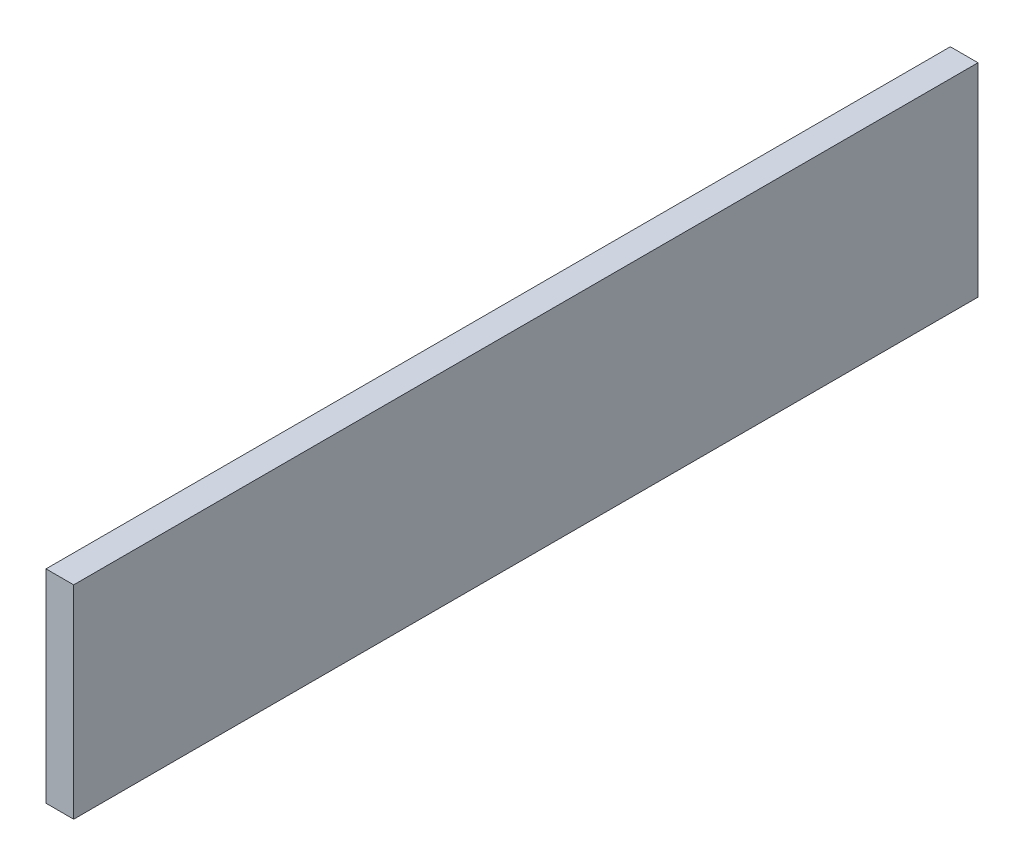
ISO-10303-21;
HEADER;
FILE_DESCRIPTION(('STEP AP214'),'2;1');
FILE_NAME('part.step','',(''),(''),'','','');
FILE_SCHEMA(('AUTOMOTIVE_DESIGN { 1 0 10303 214 1 1 1 1 }'));
ENDSEC;
DATA;
#1=APPLICATION_CONTEXT('core data for automotive mechanical design processes');
#2=APPLICATION_PROTOCOL_DEFINITION('international standard','automotive_design',2000,#1);
#3=PRODUCT_CONTEXT('',#1,'mechanical');
#4=PRODUCT('Part','Part','',(#3));
#5=PRODUCT_RELATED_PRODUCT_CATEGORY('part','',(#4));
#6=PRODUCT_DEFINITION_FORMATION('','',#4);
#7=PRODUCT_DEFINITION_CONTEXT('part definition',#1,'design');
#8=PRODUCT_DEFINITION('design','',#6,#7);
#9=PRODUCT_DEFINITION_SHAPE('','',#8);
#10=(LENGTH_UNIT() NAMED_UNIT(*) SI_UNIT(.MILLI.,.METRE.));
#11=(NAMED_UNIT(*) PLANE_ANGLE_UNIT() SI_UNIT($,.RADIAN.));
#12=(NAMED_UNIT(*) SI_UNIT($,.STERADIAN.) SOLID_ANGLE_UNIT());
#13=UNCERTAINTY_MEASURE_WITH_UNIT(LENGTH_MEASURE(1.E-05),#10,'distance_accuracy_value','');
#14=(GEOMETRIC_REPRESENTATION_CONTEXT(3) GLOBAL_UNCERTAINTY_ASSIGNED_CONTEXT((#13)) GLOBAL_UNIT_ASSIGNED_CONTEXT((#10,
#11,#12)) REPRESENTATION_CONTEXT('',''));
#15=CARTESIAN_POINT('',(0.,0.,0.));
#16=DIRECTION('',(0.,0.,1.));
#17=DIRECTION('',(1.,0.,0.));
#18=AXIS2_PLACEMENT_3D('',#15,#16,#17);
#19=CARTESIAN_POINT('',(19.05,0.,0.));
#20=DIRECTION('',(0.,0.,-1.));
#21=DIRECTION('',(-1.,0.,0.));
#22=AXIS2_PLACEMENT_3D('',#19,#20,#21);
#23=PLANE('',#22);
#24=DIRECTION('',(0.,-1.,0.));
#25=VECTOR('',#24,1.);
#26=CARTESIAN_POINT('',(0.,0.,0.));
#27=LINE('',#26,#25);
#28=CARTESIAN_POINT('',(0.,139.7,0.));
#29=VERTEX_POINT('',#28);
#30=CARTESIAN_POINT('',(0.,0.,0.));
#31=VERTEX_POINT('',#30);
#32=EDGE_CURVE('E107',#29,#31,#27,.T.);
#33=ORIENTED_EDGE('',*,*,#32,.T.);
#34=DIRECTION('',(-1.,0.,0.));
#35=VECTOR('',#34,1.);
#36=CARTESIAN_POINT('',(19.05,0.,0.));
#37=LINE('',#36,#35);
#38=CARTESIAN_POINT('',(19.05,0.,0.));
#39=VERTEX_POINT('',#38);
#40=EDGE_CURVE('E11',#39,#31,#37,.T.);
#41=ORIENTED_EDGE('',*,*,#40,.F.);
#42=DIRECTION('',(0.,-1.,0.));
#43=VECTOR('',#42,1.);
#44=CARTESIAN_POINT('',(19.05,0.,0.));
#45=LINE('',#44,#43);
#46=CARTESIAN_POINT('',(19.05,139.7,0.));
#47=VERTEX_POINT('',#46);
#48=EDGE_CURVE('E91',#47,#39,#45,.T.);
#49=ORIENTED_EDGE('',*,*,#48,.F.);
#50=DIRECTION('',(-1.,0.,0.));
#51=VECTOR('',#50,1.);
#52=CARTESIAN_POINT('',(19.05,139.7,0.));
#53=LINE('',#52,#51);
#54=EDGE_CURVE('E103',#47,#29,#53,.T.);
#55=ORIENTED_EDGE('',*,*,#54,.T.);
#56=EDGE_LOOP('',(#33,#41,#49,#55));
#57=FACE_BOUND('',#56,.T.);
#58=ADVANCED_FACE('F39',(#57),#23,.F.);
#59=CARTESIAN_POINT('',(19.05,0.,0.));
#60=DIRECTION('',(0.,1.,0.));
#61=DIRECTION('',(0.,0.,1.));
#62=AXIS2_PLACEMENT_3D('',#59,#60,#61);
#63=PLANE('',#62);
#64=DIRECTION('',(0.,0.,-1.));
#65=VECTOR('',#64,1.);
#66=CARTESIAN_POINT('',(0.,0.,0.));
#67=LINE('',#66,#65);
#68=CARTESIAN_POINT('',(0.,0.,-622.3));
#69=VERTEX_POINT('',#68);
#70=EDGE_CURVE('E96',#31,#69,#67,.T.);
#71=ORIENTED_EDGE('',*,*,#70,.T.);
#72=DIRECTION('',(-1.,0.,0.));
#73=VECTOR('',#72,1.);
#74=CARTESIAN_POINT('',(19.05,0.,-622.3));
#75=LINE('',#74,#73);
#76=CARTESIAN_POINT('',(19.05,0.,-622.3));
#77=VERTEX_POINT('',#76);
#78=EDGE_CURVE('E48',#77,#69,#75,.T.);
#79=ORIENTED_EDGE('',*,*,#78,.F.);
#80=DIRECTION('',(0.,0.,-1.));
#81=VECTOR('',#80,1.);
#82=CARTESIAN_POINT('',(19.05,0.,0.));
#83=LINE('',#82,#81);
#84=EDGE_CURVE('E86',#39,#77,#83,.T.);
#85=ORIENTED_EDGE('',*,*,#84,.F.);
#86=ORIENTED_EDGE('',*,*,#40,.T.);
#87=EDGE_LOOP('',(#71,#79,#85,#86));
#88=FACE_BOUND('',#87,.T.);
#89=ADVANCED_FACE('F95',(#88),#63,.F.);
#90=CARTESIAN_POINT('',(19.05,0.,-622.3));
#91=DIRECTION('',(0.,0.,1.));
#92=DIRECTION('',(1.,0.,0.));
#93=AXIS2_PLACEMENT_3D('',#90,#91,#92);
#94=PLANE('',#93);
#95=DIRECTION('',(0.,1.,0.));
#96=VECTOR('',#95,1.);
#97=CARTESIAN_POINT('',(0.,0.,-622.3));
#98=LINE('',#97,#96);
#99=CARTESIAN_POINT('',(0.,139.7,-622.3));
#100=VERTEX_POINT('',#99);
#101=EDGE_CURVE('E73',#69,#100,#98,.T.);
#102=ORIENTED_EDGE('',*,*,#101,.T.);
#103=DIRECTION('',(-1.,0.,0.));
#104=VECTOR('',#103,1.);
#105=CARTESIAN_POINT('',(19.05,139.7,-622.3));
#106=LINE('',#105,#104);
#107=CARTESIAN_POINT('',(19.05,139.7,-622.3));
#108=VERTEX_POINT('',#107);
#109=EDGE_CURVE('E98',#108,#100,#106,.T.);
#110=ORIENTED_EDGE('',*,*,#109,.F.);
#111=DIRECTION('',(0.,1.,0.));
#112=VECTOR('',#111,1.);
#113=CARTESIAN_POINT('',(19.05,0.,-622.3));
#114=LINE('',#113,#112);
#115=EDGE_CURVE('E89',#77,#108,#114,.T.);
#116=ORIENTED_EDGE('',*,*,#115,.F.);
#117=ORIENTED_EDGE('',*,*,#78,.T.);
#118=EDGE_LOOP('',(#102,#110,#116,#117));
#119=FACE_BOUND('',#118,.T.);
#120=ADVANCED_FACE('F99',(#119),#94,.F.);
#121=CARTESIAN_POINT('',(19.05,139.7,0.));
#122=DIRECTION('',(0.,-1.,0.));
#123=DIRECTION('',(0.,0.,-1.));
#124=AXIS2_PLACEMENT_3D('',#121,#122,#123);
#125=PLANE('',#124);
#126=DIRECTION('',(0.,0.,1.));
#127=VECTOR('',#126,1.);
#128=CARTESIAN_POINT('',(0.,139.7,0.));
#129=LINE('',#128,#127);
#130=EDGE_CURVE('E79',#100,#29,#129,.T.);
#131=ORIENTED_EDGE('',*,*,#130,.T.);
#132=ORIENTED_EDGE('',*,*,#54,.F.);
#133=DIRECTION('',(0.,0.,1.));
#134=VECTOR('',#133,1.);
#135=CARTESIAN_POINT('',(19.05,139.7,0.));
#136=LINE('',#135,#134);
#137=EDGE_CURVE('E56',#108,#47,#136,.T.);
#138=ORIENTED_EDGE('',*,*,#137,.F.);
#139=ORIENTED_EDGE('',*,*,#109,.T.);
#140=EDGE_LOOP('',(#131,#132,#138,#139));
#141=FACE_BOUND('',#140,.T.);
#142=ADVANCED_FACE('F120',(#141),#125,.F.);
#143=CARTESIAN_POINT('',(19.05,0.,0.));
#144=DIRECTION('',(-1.,0.,0.));
#145=DIRECTION('',(0.,0.,1.));
#146=AXIS2_PLACEMENT_3D('',#143,#144,#145);
#147=PLANE('',#146);
#148=ORIENTED_EDGE('',*,*,#48,.T.);
#149=ORIENTED_EDGE('',*,*,#84,.T.);
#150=ORIENTED_EDGE('',*,*,#115,.T.);
#151=ORIENTED_EDGE('',*,*,#137,.T.);
#152=EDGE_LOOP('',(#148,#149,#150,#151));
#153=FACE_BOUND('',#152,.T.);
#154=ADVANCED_FACE('F87',(#153),#147,.F.);
#155=CARTESIAN_POINT('',(0.,0.,0.));
#156=DIRECTION('',(-1.,0.,0.));
#157=DIRECTION('',(0.,0.,1.));
#158=AXIS2_PLACEMENT_3D('',#155,#156,#157);
#159=PLANE('',#158);
#160=ORIENTED_EDGE('',*,*,#32,.F.);
#161=ORIENTED_EDGE('',*,*,#130,.F.);
#162=ORIENTED_EDGE('',*,*,#101,.F.);
#163=ORIENTED_EDGE('',*,*,#70,.F.);
#164=EDGE_LOOP('',(#160,#161,#162,#163));
#165=FACE_BOUND('',#164,.T.);
#166=ADVANCED_FACE('F123',(#165),#159,.T.);
#167=CLOSED_SHELL('',(#58,#89,#120,#142,#154,#166));
#168=MANIFOLD_SOLID_BREP('B2',#167);
#169=ADVANCED_BREP_SHAPE_REPRESENTATION('',(#18,#168),#14);
#170=SHAPE_DEFINITION_REPRESENTATION(#9,#169);
ENDSEC;
END-ISO-10303-21;
